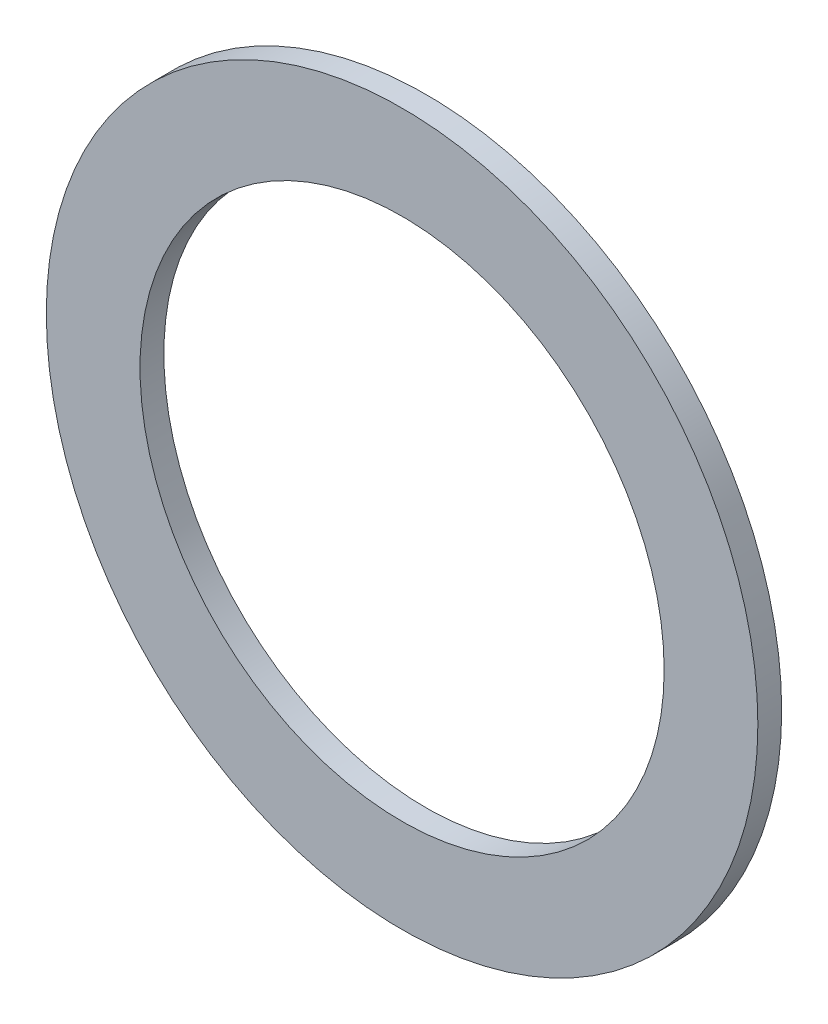
ISO-10303-21;
HEADER;
FILE_DESCRIPTION(('STEP AP214'),'2;1');
FILE_NAME('part.step','',(''),(''),'','','');
FILE_SCHEMA(('AUTOMOTIVE_DESIGN { 1 0 10303 214 1 1 1 1 }'));
ENDSEC;
DATA;
#1=APPLICATION_CONTEXT('core data for automotive mechanical design processes');
#2=APPLICATION_PROTOCOL_DEFINITION('international standard','automotive_design',2000,#1);
#3=PRODUCT_CONTEXT('',#1,'mechanical');
#4=PRODUCT('Part','Part','',(#3));
#5=PRODUCT_RELATED_PRODUCT_CATEGORY('part','',(#4));
#6=PRODUCT_DEFINITION_FORMATION('','',#4);
#7=PRODUCT_DEFINITION_CONTEXT('part definition',#1,'design');
#8=PRODUCT_DEFINITION('design','',#6,#7);
#9=PRODUCT_DEFINITION_SHAPE('','',#8);
#10=(LENGTH_UNIT() NAMED_UNIT(*) SI_UNIT(.MILLI.,.METRE.));
#11=(NAMED_UNIT(*) PLANE_ANGLE_UNIT() SI_UNIT($,.RADIAN.));
#12=(NAMED_UNIT(*) SI_UNIT($,.STERADIAN.) SOLID_ANGLE_UNIT());
#13=UNCERTAINTY_MEASURE_WITH_UNIT(LENGTH_MEASURE(1.E-05),#10,'distance_accuracy_value','');
#14=(GEOMETRIC_REPRESENTATION_CONTEXT(3) GLOBAL_UNCERTAINTY_ASSIGNED_CONTEXT((#13)) GLOBAL_UNIT_ASSIGNED_CONTEXT((#10,
#11,#12)) REPRESENTATION_CONTEXT('',''));
#15=CARTESIAN_POINT('',(0.,0.,0.));
#16=DIRECTION('',(0.,0.,1.));
#17=DIRECTION('',(1.,0.,0.));
#18=AXIS2_PLACEMENT_3D('',#15,#16,#17);
#19=CARTESIAN_POINT('',(0.,0.,3.));
#20=DIRECTION('',(0.,0.,1.));
#21=DIRECTION('',(1.,0.,0.));
#22=AXIS2_PLACEMENT_3D('',#19,#20,#21);
#23=PLANE('',#22);
#24=CARTESIAN_POINT('',(0.,0.,3.));
#25=DIRECTION('',(0.,0.,1.));
#26=DIRECTION('',(1.,0.,0.));
#27=AXIS2_PLACEMENT_3D('',#24,#25,#26);
#28=CIRCLE('',#27,44.8);
#29=CARTESIAN_POINT('',(44.8,0.,3.));
#30=VERTEX_POINT('',#29);
#31=EDGE_CURVE('E10',#30,#30,#28,.T.);
#32=ORIENTED_EDGE('',*,*,#31,.T.);
#33=EDGE_LOOP('',(#32));
#34=FACE_BOUND('',#33,.T.);
#35=CARTESIAN_POINT('',(0.,0.,3.));
#36=DIRECTION('',(0.,0.,1.));
#37=DIRECTION('',(1.,0.,0.));
#38=AXIS2_PLACEMENT_3D('',#35,#36,#37);
#39=CIRCLE('',#38,33.);
#40=CARTESIAN_POINT('',(33.,0.,3.));
#41=VERTEX_POINT('',#40);
#42=EDGE_CURVE('E48',#41,#41,#39,.T.);
#43=ORIENTED_EDGE('',*,*,#42,.F.);
#44=EDGE_LOOP('',(#43));
#45=FACE_BOUND('',#44,.T.);
#46=ADVANCED_FACE('F37',(#34,#45),#23,.T.);
#47=CARTESIAN_POINT('',(0.,0.,0.));
#48=DIRECTION('',(0.,0.,1.));
#49=DIRECTION('',(1.,0.,0.));
#50=AXIS2_PLACEMENT_3D('',#47,#48,#49);
#51=PLANE('',#50);
#52=CARTESIAN_POINT('',(0.,0.,0.));
#53=DIRECTION('',(0.,0.,1.));
#54=DIRECTION('',(1.,0.,0.));
#55=AXIS2_PLACEMENT_3D('',#52,#53,#54);
#56=CIRCLE('',#55,44.8);
#57=CARTESIAN_POINT('',(44.8,0.,0.));
#58=VERTEX_POINT('',#57);
#59=EDGE_CURVE('E41',#58,#58,#56,.T.);
#60=ORIENTED_EDGE('',*,*,#59,.F.);
#61=EDGE_LOOP('',(#60));
#62=FACE_BOUND('',#61,.T.);
#63=CARTESIAN_POINT('',(0.,0.,0.));
#64=DIRECTION('',(0.,0.,1.));
#65=DIRECTION('',(1.,0.,0.));
#66=AXIS2_PLACEMENT_3D('',#63,#64,#65);
#67=CIRCLE('',#66,33.);
#68=CARTESIAN_POINT('',(33.,0.,0.));
#69=VERTEX_POINT('',#68);
#70=EDGE_CURVE('E50',#69,#69,#67,.T.);
#71=ORIENTED_EDGE('',*,*,#70,.T.);
#72=EDGE_LOOP('',(#71));
#73=FACE_BOUND('',#72,.T.);
#74=ADVANCED_FACE('F60',(#62,#73),#51,.F.);
#75=CARTESIAN_POINT('',(0.,0.,3.));
#76=DIRECTION('',(0.,0.,-1.));
#77=DIRECTION('',(-1.,0.,0.));
#78=AXIS2_PLACEMENT_3D('',#75,#76,#77);
#79=CYLINDRICAL_SURFACE('',#78,44.8);
#80=ORIENTED_EDGE('',*,*,#31,.F.);
#81=EDGE_LOOP('',(#80));
#82=FACE_BOUND('',#81,.T.);
#83=ORIENTED_EDGE('',*,*,#59,.T.);
#84=EDGE_LOOP('',(#83));
#85=FACE_BOUND('',#84,.T.);
#86=ADVANCED_FACE('F39',(#82,#85),#79,.T.);
#87=CARTESIAN_POINT('',(0.,0.,3.));
#88=DIRECTION('',(0.,0.,-1.));
#89=DIRECTION('',(-1.,0.,0.));
#90=AXIS2_PLACEMENT_3D('',#87,#88,#89);
#91=CYLINDRICAL_SURFACE('',#90,33.);
#92=ORIENTED_EDGE('',*,*,#42,.T.);
#93=EDGE_LOOP('',(#92));
#94=FACE_BOUND('',#93,.T.);
#95=ORIENTED_EDGE('',*,*,#70,.F.);
#96=EDGE_LOOP('',(#95));
#97=FACE_BOUND('',#96,.T.);
#98=ADVANCED_FACE('F56',(#94,#97),#91,.F.);
#99=CLOSED_SHELL('',(#46,#74,#86,#98));
#100=MANIFOLD_SOLID_BREP('B2',#99);
#101=ADVANCED_BREP_SHAPE_REPRESENTATION('',(#18,#100),#14);
#102=SHAPE_DEFINITION_REPRESENTATION(#9,#101);
ENDSEC;
END-ISO-10303-21;
